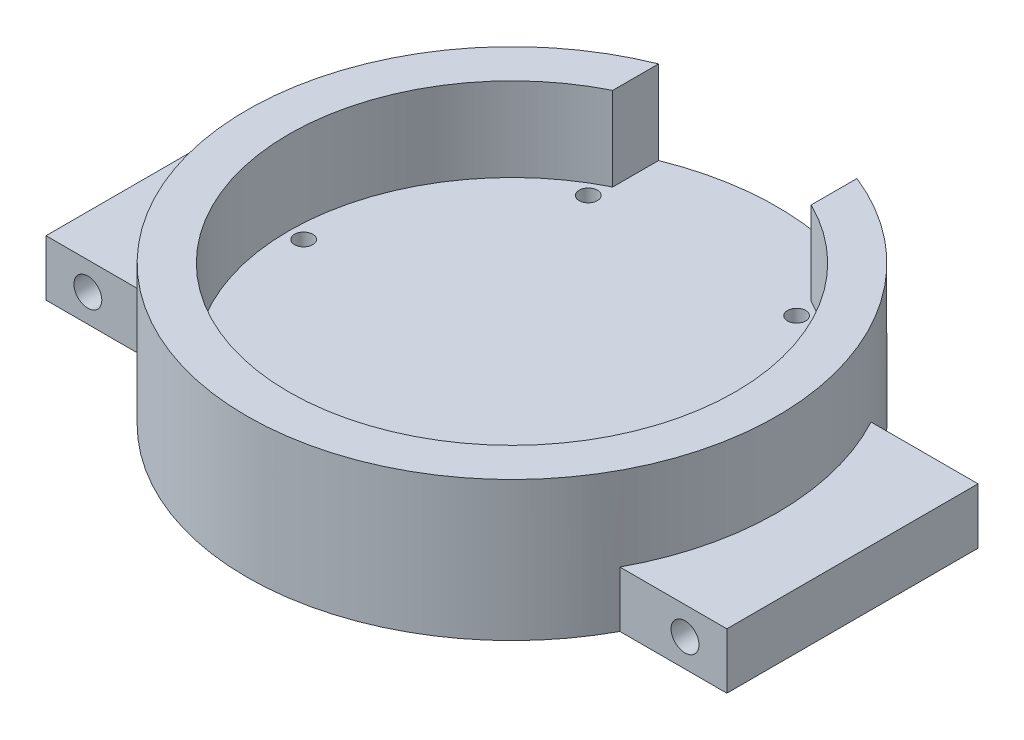
ISO-10303-21;
HEADER;
FILE_DESCRIPTION(('STEP AP214'),'2;1');
FILE_NAME('part.step','',(''),(''),'','','');
FILE_SCHEMA(('AUTOMOTIVE_DESIGN { 1 0 10303 214 1 1 1 1 }'));
ENDSEC;
DATA;
#1=APPLICATION_CONTEXT('core data for automotive mechanical design processes');
#2=APPLICATION_PROTOCOL_DEFINITION('international standard','automotive_design',2000,#1);
#3=PRODUCT_CONTEXT('',#1,'mechanical');
#4=PRODUCT('Part','Part','',(#3));
#5=PRODUCT_RELATED_PRODUCT_CATEGORY('part','',(#4));
#6=PRODUCT_DEFINITION_FORMATION('','',#4);
#7=PRODUCT_DEFINITION_CONTEXT('part definition',#1,'design');
#8=PRODUCT_DEFINITION('design','',#6,#7);
#9=PRODUCT_DEFINITION_SHAPE('','',#8);
#10=(LENGTH_UNIT() NAMED_UNIT(*) SI_UNIT(.MILLI.,.METRE.));
#11=(NAMED_UNIT(*) PLANE_ANGLE_UNIT() SI_UNIT($,.RADIAN.));
#12=(NAMED_UNIT(*) SI_UNIT($,.STERADIAN.) SOLID_ANGLE_UNIT());
#13=UNCERTAINTY_MEASURE_WITH_UNIT(LENGTH_MEASURE(1.E-05),#10,'distance_accuracy_value','');
#14=(GEOMETRIC_REPRESENTATION_CONTEXT(3) GLOBAL_UNCERTAINTY_ASSIGNED_CONTEXT((#13)) GLOBAL_UNIT_ASSIGNED_CONTEXT((#10,
#11,#12)) REPRESENTATION_CONTEXT('',''));
#15=CARTESIAN_POINT('',(0.,0.,0.));
#16=DIRECTION('',(0.,0.,1.));
#17=DIRECTION('',(1.,0.,0.));
#18=AXIS2_PLACEMENT_3D('',#15,#16,#17);
#19=CARTESIAN_POINT('',(0.,25.,-22.5));
#20=DIRECTION('',(0.,-1.,0.));
#21=DIRECTION('',(0.,0.,-1.));
#22=AXIS2_PLACEMENT_3D('',#19,#20,#21);
#23=CYLINDRICAL_SURFACE('',#22,40.);
#24=DIRECTION('',(0.,-1.,0.));
#25=VECTOR('',#24,1.);
#26=CARTESIAN_POINT('',(17.78,25.,-58.3311540422577));
#27=LINE('',#26,#25);
#28=CARTESIAN_POINT('',(17.78,25.,-58.3311540422577));
#29=VERTEX_POINT('',#28);
#30=CARTESIAN_POINT('',(17.78,10.,-58.3311540422577));
#31=VERTEX_POINT('',#30);
#32=EDGE_CURVE('E155',#29,#31,#27,.T.);
#33=ORIENTED_EDGE('',*,*,#32,.T.);
#34=CARTESIAN_POINT('',(0.,10.,-22.5));
#35=DIRECTION('',(0.,-1.,0.));
#36=DIRECTION('',(0.,0.,-1.));
#37=AXIS2_PLACEMENT_3D('',#34,#35,#36);
#38=CIRCLE('',#37,40.);
#39=CARTESIAN_POINT('',(-17.78,10.,-58.3311540422577));
#40=VERTEX_POINT('',#39);
#41=EDGE_CURVE('E12',#31,#40,#38,.T.);
#42=ORIENTED_EDGE('',*,*,#41,.T.);
#43=DIRECTION('',(0.,-1.,0.));
#44=VECTOR('',#43,1.);
#45=CARTESIAN_POINT('',(-17.78,25.,-58.3311540422577));
#46=LINE('',#45,#44);
#47=CARTESIAN_POINT('',(-17.78,25.,-58.3311540422577));
#48=VERTEX_POINT('',#47);
#49=EDGE_CURVE('E76',#48,#40,#46,.T.);
#50=ORIENTED_EDGE('',*,*,#49,.F.);
#51=CARTESIAN_POINT('',(0.,25.,-22.5));
#52=DIRECTION('',(0.,-1.,0.));
#53=DIRECTION('',(0.,0.,-1.));
#54=AXIS2_PLACEMENT_3D('',#51,#52,#53);
#55=CIRCLE('',#54,40.);
#56=EDGE_CURVE('E171',#29,#48,#55,.T.);
#57=ORIENTED_EDGE('',*,*,#56,.F.);
#58=EDGE_LOOP('',(#33,#42,#50,#57));
#59=FACE_BOUND('',#58,.T.);
#60=ADVANCED_FACE('F64',(#59),#23,.F.);
#61=CARTESIAN_POINT('',(0.,25.,-22.5));
#62=DIRECTION('',(0.,-1.,0.));
#63=DIRECTION('',(0.,0.,-1.));
#64=AXIS2_PLACEMENT_3D('',#61,#62,#63);
#65=CYLINDRICAL_SURFACE('',#64,47.5);
#66=DIRECTION('',(0.,-1.,0.));
#67=VECTOR('',#66,1.);
#68=CARTESIAN_POINT('',(41.8330013267038,25.,-45.));
#69=LINE('',#68,#67);
#70=CARTESIAN_POINT('',(41.8330013267038,0.,-45.));
#71=VERTEX_POINT('',#70);
#72=CARTESIAN_POINT('',(41.8330013267038,10.,-45.));
#73=VERTEX_POINT('',#72);
#74=EDGE_CURVE('E193',#71,#73,#69,.F.);
#75=ORIENTED_EDGE('',*,*,#74,.F.);
#76=CARTESIAN_POINT('',(0.,0.,-22.5));
#77=DIRECTION('',(0.,-1.,0.));
#78=DIRECTION('',(0.,0.,-1.));
#79=AXIS2_PLACEMENT_3D('',#76,#77,#78);
#80=CIRCLE('',#79,47.5);
#81=CARTESIAN_POINT('',(-41.8330013267038,0.,-45.));
#82=VERTEX_POINT('',#81);
#83=EDGE_CURVE('E184',#82,#71,#80,.T.);
#84=ORIENTED_EDGE('',*,*,#83,.F.);
#85=DIRECTION('',(0.,-1.,0.));
#86=VECTOR('',#85,1.);
#87=CARTESIAN_POINT('',(-41.8330013267038,25.,-45.));
#88=LINE('',#87,#86);
#89=CARTESIAN_POINT('',(-41.8330013267038,10.,-45.));
#90=VERTEX_POINT('',#89);
#91=EDGE_CURVE('E178',#90,#82,#88,.T.);
#92=ORIENTED_EDGE('',*,*,#91,.F.);
#93=CARTESIAN_POINT('',(0.,10.,-22.5));
#94=DIRECTION('',(0.,-1.,0.));
#95=DIRECTION('',(0.,0.,-1.));
#96=AXIS2_PLACEMENT_3D('',#93,#94,#95);
#97=CIRCLE('',#96,47.5);
#98=CARTESIAN_POINT('',(-41.8330013267038,10.,0.));
#99=VERTEX_POINT('',#98);
#100=EDGE_CURVE('E87',#99,#90,#97,.T.);
#101=ORIENTED_EDGE('',*,*,#100,.F.);
#102=DIRECTION('',(0.,-1.,0.));
#103=VECTOR('',#102,1.);
#104=CARTESIAN_POINT('',(-41.8330013267038,25.,0.));
#105=LINE('',#104,#103);
#106=CARTESIAN_POINT('',(-41.8330013267038,0.,0.));
#107=VERTEX_POINT('',#106);
#108=EDGE_CURVE('E188',#107,#99,#105,.F.);
#109=ORIENTED_EDGE('',*,*,#108,.F.);
#110=CARTESIAN_POINT('',(41.8330013267038,0.,0.));
#111=VERTEX_POINT('',#110);
#112=EDGE_CURVE('E181',#111,#107,#80,.T.);
#113=ORIENTED_EDGE('',*,*,#112,.F.);
#114=DIRECTION('',(0.,-1.,0.));
#115=VECTOR('',#114,1.);
#116=CARTESIAN_POINT('',(41.8330013267038,25.,0.));
#117=LINE('',#116,#115);
#118=CARTESIAN_POINT('',(41.8330013267038,10.,0.));
#119=VERTEX_POINT('',#118);
#120=EDGE_CURVE('E191',#119,#111,#117,.T.);
#121=ORIENTED_EDGE('',*,*,#120,.F.);
#122=EDGE_CURVE('E179',#73,#119,#97,.T.);
#123=ORIENTED_EDGE('',*,*,#122,.F.);
#124=EDGE_LOOP('',(#75,#84,#92,#101,#109,#113,#121,#123));
#125=FACE_BOUND('',#124,.T.);
#126=CARTESIAN_POINT('',(0.,10.,-22.5));
#127=DIRECTION('',(0.,1.,0.));
#128=DIRECTION('',(0.,0.,1.));
#129=AXIS2_PLACEMENT_3D('',#126,#127,#128);
#130=CIRCLE('',#129,47.5);
#131=CARTESIAN_POINT('',(17.78,10.,-66.5468114623522));
#132=VERTEX_POINT('',#131);
#133=CARTESIAN_POINT('',(-17.78,10.,-66.5468114623522));
#134=VERTEX_POINT('',#133);
#135=EDGE_CURVE('E296',#132,#134,#130,.T.);
#136=ORIENTED_EDGE('',*,*,#135,.F.);
#137=DIRECTION('',(0.,-1.,0.));
#138=VECTOR('',#137,1.);
#139=CARTESIAN_POINT('',(17.78,25.,-66.5468114623522));
#140=LINE('',#139,#138);
#141=CARTESIAN_POINT('',(17.78,25.,-66.5468114623522));
#142=VERTEX_POINT('',#141);
#143=EDGE_CURVE('E165',#142,#132,#140,.T.);
#144=ORIENTED_EDGE('',*,*,#143,.F.);
#145=CARTESIAN_POINT('',(0.,25.,-22.5));
#146=DIRECTION('',(0.,-1.,0.));
#147=DIRECTION('',(0.,0.,-1.));
#148=AXIS2_PLACEMENT_3D('',#145,#146,#147);
#149=CIRCLE('',#148,47.5);
#150=CARTESIAN_POINT('',(-17.78,25.,-66.5468114623522));
#151=VERTEX_POINT('',#150);
#152=EDGE_CURVE('E173',#142,#151,#149,.T.);
#153=ORIENTED_EDGE('',*,*,#152,.T.);
#154=DIRECTION('',(0.,-1.,0.));
#155=VECTOR('',#154,1.);
#156=CARTESIAN_POINT('',(-17.78,25.,-66.5468114623522));
#157=LINE('',#156,#155);
#158=EDGE_CURVE('E305',#151,#134,#157,.T.);
#159=ORIENTED_EDGE('',*,*,#158,.T.);
#160=EDGE_LOOP('',(#136,#144,#153,#159));
#161=FACE_BOUND('',#160,.T.);
#162=ADVANCED_FACE('F331',(#125,#161),#65,.T.);
#163=CARTESIAN_POINT('',(0.,25.,0.));
#164=DIRECTION('',(0.,-1.,0.));
#165=DIRECTION('',(0.,0.,-1.));
#166=AXIS2_PLACEMENT_3D('',#163,#164,#165);
#167=PLANE('',#166);
#168=DIRECTION('',(0.,0.,-1.));
#169=VECTOR('',#168,1.);
#170=CARTESIAN_POINT('',(17.78,25.,-58.3311540422577));
#171=LINE('',#170,#169);
#172=EDGE_CURVE('E157',#29,#142,#171,.T.);
#173=ORIENTED_EDGE('',*,*,#172,.F.);
#174=ORIENTED_EDGE('',*,*,#56,.T.);
#175=DIRECTION('',(0.,0.,1.));
#176=VECTOR('',#175,1.);
#177=CARTESIAN_POINT('',(-17.78,25.,-58.3311540422577));
#178=LINE('',#177,#176);
#179=EDGE_CURVE('E172',#151,#48,#178,.T.);
#180=ORIENTED_EDGE('',*,*,#179,.F.);
#181=ORIENTED_EDGE('',*,*,#152,.F.);
#182=EDGE_LOOP('',(#173,#174,#180,#181));
#183=FACE_BOUND('',#182,.T.);
#184=ADVANCED_FACE('F169',(#183),#167,.F.);
#185=CARTESIAN_POINT('',(0.,10.,0.));
#186=DIRECTION('',(0.,-1.,0.));
#187=DIRECTION('',(0.,0.,-1.));
#188=AXIS2_PLACEMENT_3D('',#185,#186,#187);
#189=PLANE('',#188);
#190=DIRECTION('',(-1.,0.,0.));
#191=VECTOR('',#190,1.);
#192=CARTESIAN_POINT('',(-61.,10.,-45.));
#193=LINE('',#192,#191);
#194=CARTESIAN_POINT('',(61.,10.,-45.));
#195=VERTEX_POINT('',#194);
#196=EDGE_CURVE('E210',#195,#73,#193,.T.);
#197=ORIENTED_EDGE('',*,*,#196,.T.);
#198=ORIENTED_EDGE('',*,*,#122,.T.);
#199=DIRECTION('',(1.,0.,0.));
#200=VECTOR('',#199,1.);
#201=CARTESIAN_POINT('',(-61.,10.,0.));
#202=LINE('',#201,#200);
#203=CARTESIAN_POINT('',(61.,10.,0.));
#204=VERTEX_POINT('',#203);
#205=EDGE_CURVE('E198',#119,#204,#202,.T.);
#206=ORIENTED_EDGE('',*,*,#205,.T.);
#207=DIRECTION('',(0.,0.,-1.));
#208=VECTOR('',#207,1.);
#209=CARTESIAN_POINT('',(61.,10.,0.));
#210=LINE('',#209,#208);
#211=EDGE_CURVE('E203',#204,#195,#210,.T.);
#212=ORIENTED_EDGE('',*,*,#211,.T.);
#213=EDGE_LOOP('',(#197,#198,#206,#212));
#214=FACE_BOUND('',#213,.T.);
#215=ADVANCED_FACE('F343',(#214),#189,.F.);
#216=CARTESIAN_POINT('',(-61.,10.,0.));
#217=DIRECTION('',(0.,0.,-1.));
#218=DIRECTION('',(-1.,0.,0.));
#219=AXIS2_PLACEMENT_3D('',#216,#217,#218);
#220=PLANE('',#219);
#221=CARTESIAN_POINT('',(-53.5,5.,0.));
#222=DIRECTION('',(0.,0.,1.));
#223=DIRECTION('',(1.,0.,0.));
#224=AXIS2_PLACEMENT_3D('',#221,#222,#223);
#225=CIRCLE('',#224,2.5);
#226=CARTESIAN_POINT('',(-51.,5.,0.));
#227=VERTEX_POINT('',#226);
#228=EDGE_CURVE('E231',#227,#227,#225,.T.);
#229=ORIENTED_EDGE('',*,*,#228,.F.);
#230=EDGE_LOOP('',(#229));
#231=FACE_BOUND('',#230,.T.);
#232=DIRECTION('',(1.,0.,0.));
#233=VECTOR('',#232,1.);
#234=CARTESIAN_POINT('',(-61.,0.,0.));
#235=LINE('',#234,#233);
#236=CARTESIAN_POINT('',(-61.,0.,0.));
#237=VERTEX_POINT('',#236);
#238=EDGE_CURVE('E213',#237,#107,#235,.T.);
#239=ORIENTED_EDGE('',*,*,#238,.T.);
#240=ORIENTED_EDGE('',*,*,#108,.T.);
#241=CARTESIAN_POINT('',(-61.,10.,0.));
#242=VERTEX_POINT('',#241);
#243=EDGE_CURVE('E202',#242,#99,#202,.T.);
#244=ORIENTED_EDGE('',*,*,#243,.F.);
#245=DIRECTION('',(0.,-1.,0.));
#246=VECTOR('',#245,1.);
#247=CARTESIAN_POINT('',(-61.,10.,0.));
#248=LINE('',#247,#246);
#249=EDGE_CURVE('E68',#242,#237,#248,.T.);
#250=ORIENTED_EDGE('',*,*,#249,.T.);
#251=EDGE_LOOP('',(#239,#240,#244,#250));
#252=FACE_BOUND('',#251,.T.);
#253=ADVANCED_FACE('F357',(#231,#252),#220,.F.);
#254=CARTESIAN_POINT('',(-61.,10.,-45.));
#255=DIRECTION('',(0.,0.,1.));
#256=DIRECTION('',(1.,0.,0.));
#257=AXIS2_PLACEMENT_3D('',#254,#255,#256);
#258=PLANE('',#257);
#259=CARTESIAN_POINT('',(53.5,5.,-45.));
#260=DIRECTION('',(0.,0.,1.));
#261=DIRECTION('',(1.,0.,0.));
#262=AXIS2_PLACEMENT_3D('',#259,#260,#261);
#263=CIRCLE('',#262,2.5);
#264=CARTESIAN_POINT('',(56.,5.,-45.));
#265=VERTEX_POINT('',#264);
#266=EDGE_CURVE('E190',#265,#265,#263,.T.);
#267=ORIENTED_EDGE('',*,*,#266,.T.);
#268=EDGE_LOOP('',(#267));
#269=FACE_BOUND('',#268,.T.);
#270=DIRECTION('',(-1.,0.,0.));
#271=VECTOR('',#270,1.);
#272=CARTESIAN_POINT('',(-61.,0.,-45.));
#273=LINE('',#272,#271);
#274=CARTESIAN_POINT('',(61.,0.,-45.));
#275=VERTEX_POINT('',#274);
#276=EDGE_CURVE('E201',#275,#71,#273,.T.);
#277=ORIENTED_EDGE('',*,*,#276,.T.);
#278=ORIENTED_EDGE('',*,*,#74,.T.);
#279=ORIENTED_EDGE('',*,*,#196,.F.);
#280=DIRECTION('',(0.,-1.,0.));
#281=VECTOR('',#280,1.);
#282=CARTESIAN_POINT('',(61.,10.,-45.));
#283=LINE('',#282,#281);
#284=EDGE_CURVE('E222',#195,#275,#283,.T.);
#285=ORIENTED_EDGE('',*,*,#284,.T.);
#286=EDGE_LOOP('',(#277,#278,#279,#285));
#287=FACE_BOUND('',#286,.T.);
#288=ADVANCED_FACE('F315',(#269,#287),#258,.F.);
#289=CARTESIAN_POINT('',(-61.,10.,0.));
#290=DIRECTION('',(1.,0.,0.));
#291=DIRECTION('',(0.,0.,-1.));
#292=AXIS2_PLACEMENT_3D('',#289,#290,#291);
#293=PLANE('',#292);
#294=DIRECTION('',(0.,0.,1.));
#295=VECTOR('',#294,1.);
#296=CARTESIAN_POINT('',(-61.,0.,0.));
#297=LINE('',#296,#295);
#298=CARTESIAN_POINT('',(-61.,0.,-45.));
#299=VERTEX_POINT('',#298);
#300=EDGE_CURVE('E192',#299,#237,#297,.T.);
#301=ORIENTED_EDGE('',*,*,#300,.T.);
#302=ORIENTED_EDGE('',*,*,#249,.F.);
#303=DIRECTION('',(0.,0.,1.));
#304=VECTOR('',#303,1.);
#305=CARTESIAN_POINT('',(-61.,10.,0.));
#306=LINE('',#305,#304);
#307=CARTESIAN_POINT('',(-61.,10.,-45.));
#308=VERTEX_POINT('',#307);
#309=EDGE_CURVE('E199',#308,#242,#306,.T.);
#310=ORIENTED_EDGE('',*,*,#309,.F.);
#311=DIRECTION('',(0.,-1.,0.));
#312=VECTOR('',#311,1.);
#313=CARTESIAN_POINT('',(-61.,10.,-45.));
#314=LINE('',#313,#312);
#315=EDGE_CURVE('E208',#308,#299,#314,.T.);
#316=ORIENTED_EDGE('',*,*,#315,.T.);
#317=EDGE_LOOP('',(#301,#302,#310,#316));
#318=FACE_BOUND('',#317,.T.);
#319=ADVANCED_FACE('F65',(#318),#293,.F.);
#320=CARTESIAN_POINT('',(53.5,5.,0.));
#321=DIRECTION('',(0.,0.,1.));
#322=DIRECTION('',(1.,0.,0.));
#323=AXIS2_PLACEMENT_3D('',#320,#321,#322);
#324=CIRCLE('',#323,2.5);
#325=CARTESIAN_POINT('',(56.,5.,0.));
#326=VERTEX_POINT('',#325);
#327=EDGE_CURVE('E161',#326,#326,#324,.T.);
#328=ORIENTED_EDGE('',*,*,#327,.F.);
#329=EDGE_LOOP('',(#328));
#330=FACE_BOUND('',#329,.T.);
#331=ORIENTED_EDGE('',*,*,#205,.F.);
#332=ORIENTED_EDGE('',*,*,#120,.T.);
#333=CARTESIAN_POINT('',(61.,0.,0.));
#334=VERTEX_POINT('',#333);
#335=EDGE_CURVE('E215',#111,#334,#235,.T.);
#336=ORIENTED_EDGE('',*,*,#335,.T.);
#337=DIRECTION('',(0.,-1.,0.));
#338=VECTOR('',#337,1.);
#339=CARTESIAN_POINT('',(61.,10.,0.));
#340=LINE('',#339,#338);
#341=EDGE_CURVE('E225',#204,#334,#340,.T.);
#342=ORIENTED_EDGE('',*,*,#341,.F.);
#343=EDGE_LOOP('',(#331,#332,#336,#342));
#344=FACE_BOUND('',#343,.T.);
#345=ADVANCED_FACE('F354',(#330,#344),#220,.F.);
#346=CARTESIAN_POINT('',(61.,10.,0.));
#347=DIRECTION('',(-1.,0.,0.));
#348=DIRECTION('',(0.,0.,1.));
#349=AXIS2_PLACEMENT_3D('',#346,#347,#348);
#350=PLANE('',#349);
#351=DIRECTION('',(0.,0.,-1.));
#352=VECTOR('',#351,1.);
#353=CARTESIAN_POINT('',(61.,0.,0.));
#354=LINE('',#353,#352);
#355=EDGE_CURVE('E217',#334,#275,#354,.T.);
#356=ORIENTED_EDGE('',*,*,#355,.T.);
#357=ORIENTED_EDGE('',*,*,#284,.F.);
#358=ORIENTED_EDGE('',*,*,#211,.F.);
#359=ORIENTED_EDGE('',*,*,#341,.T.);
#360=EDGE_LOOP('',(#356,#357,#358,#359));
#361=FACE_BOUND('',#360,.T.);
#362=ADVANCED_FACE('F348',(#361),#350,.F.);
#363=CARTESIAN_POINT('',(-53.5,5.,-45.));
#364=DIRECTION('',(0.,0.,1.));
#365=DIRECTION('',(1.,0.,0.));
#366=AXIS2_PLACEMENT_3D('',#363,#364,#365);
#367=CIRCLE('',#366,2.5);
#368=CARTESIAN_POINT('',(-51.,5.,-45.));
#369=VERTEX_POINT('',#368);
#370=EDGE_CURVE('E229',#369,#369,#367,.T.);
#371=ORIENTED_EDGE('',*,*,#370,.T.);
#372=EDGE_LOOP('',(#371));
#373=FACE_BOUND('',#372,.T.);
#374=EDGE_CURVE('E207',#90,#308,#193,.T.);
#375=ORIENTED_EDGE('',*,*,#374,.F.);
#376=ORIENTED_EDGE('',*,*,#91,.T.);
#377=EDGE_CURVE('E220',#82,#299,#273,.T.);
#378=ORIENTED_EDGE('',*,*,#377,.T.);
#379=ORIENTED_EDGE('',*,*,#315,.F.);
#380=EDGE_LOOP('',(#375,#376,#378,#379));
#381=FACE_BOUND('',#380,.T.);
#382=ADVANCED_FACE('F345',(#373,#381),#258,.F.);
#383=ORIENTED_EDGE('',*,*,#243,.T.);
#384=ORIENTED_EDGE('',*,*,#100,.T.);
#385=ORIENTED_EDGE('',*,*,#374,.T.);
#386=ORIENTED_EDGE('',*,*,#309,.T.);
#387=EDGE_LOOP('',(#383,#384,#385,#386));
#388=FACE_BOUND('',#387,.T.);
#389=ADVANCED_FACE('F339',(#388),#189,.F.);
#390=CARTESIAN_POINT('',(0.,0.,0.));
#391=DIRECTION('',(0.,-1.,0.));
#392=DIRECTION('',(0.,0.,-1.));
#393=AXIS2_PLACEMENT_3D('',#390,#391,#392);
#394=PLANE('',#393);
#395=CARTESIAN_POINT('',(-18.6665000000004,0.,9.83132639948424));
#396=DIRECTION('',(0.,-1.,0.));
#397=DIRECTION('',(0.,0.,-1.));
#398=AXIS2_PLACEMENT_3D('',#395,#396,#397);
#399=CIRCLE('',#398,3.37311999999999);
#400=CARTESIAN_POINT('',(-18.6665000000004,0.,6.45820639948424));
#401=VERTEX_POINT('',#400);
#402=EDGE_CURVE('E482',#401,#401,#399,.T.);
#403=ORIENTED_EDGE('',*,*,#402,.F.);
#404=EDGE_LOOP('',(#403));
#405=FACE_BOUND('',#404,.T.);
#406=CARTESIAN_POINT('',(18.6664999999997,0.,9.83132639948461));
#407=DIRECTION('',(0.,-1.,0.));
#408=DIRECTION('',(0.,0.,-1.));
#409=AXIS2_PLACEMENT_3D('',#406,#407,#408);
#410=CIRCLE('',#409,3.37311999999999);
#411=CARTESIAN_POINT('',(18.6664999999997,0.,6.45820639948462));
#412=VERTEX_POINT('',#411);
#413=EDGE_CURVE('E267',#412,#412,#410,.T.);
#414=ORIENTED_EDGE('',*,*,#413,.F.);
#415=EDGE_LOOP('',(#414));
#416=FACE_BOUND('',#415,.T.);
#417=CARTESIAN_POINT('',(37.333,0.,-22.4999999999997));
#418=DIRECTION('',(0.,-1.,0.));
#419=DIRECTION('',(0.,0.,-1.));
#420=AXIS2_PLACEMENT_3D('',#417,#418,#419);
#421=CIRCLE('',#420,3.37311999999999);
#422=CARTESIAN_POINT('',(37.333,0.,-25.8731199999997));
#423=VERTEX_POINT('',#422);
#424=EDGE_CURVE('E251',#423,#423,#421,.T.);
#425=ORIENTED_EDGE('',*,*,#424,.F.);
#426=EDGE_LOOP('',(#425));
#427=FACE_BOUND('',#426,.T.);
#428=CARTESIAN_POINT('',(18.6665000000002,0.,-54.8313263994844));
#429=DIRECTION('',(0.,-1.,0.));
#430=DIRECTION('',(0.,0.,-1.));
#431=AXIS2_PLACEMENT_3D('',#428,#429,#430);
#432=CIRCLE('',#431,3.37311999999999);
#433=CARTESIAN_POINT('',(18.6665000000002,0.,-58.2044463994844));
#434=VERTEX_POINT('',#433);
#435=EDGE_CURVE('E249',#434,#434,#432,.T.);
#436=ORIENTED_EDGE('',*,*,#435,.F.);
#437=EDGE_LOOP('',(#436));
#438=FACE_BOUND('',#437,.T.);
#439=CARTESIAN_POINT('',(-18.6664999999999,0.,-54.8313263994845));
#440=DIRECTION('',(0.,-1.,0.));
#441=DIRECTION('',(0.,0.,-1.));
#442=AXIS2_PLACEMENT_3D('',#439,#440,#441);
#443=CIRCLE('',#442,3.37311999999999);
#444=CARTESIAN_POINT('',(-18.6664999999999,0.,-58.2044463994845));
#445=VERTEX_POINT('',#444);
#446=EDGE_CURVE('E246',#445,#445,#443,.T.);
#447=ORIENTED_EDGE('',*,*,#446,.F.);
#448=EDGE_LOOP('',(#447));
#449=FACE_BOUND('',#448,.T.);
#450=CARTESIAN_POINT('',(-37.333,0.,-22.5));
#451=DIRECTION('',(0.,-1.,0.));
#452=DIRECTION('',(0.,0.,-1.));
#453=AXIS2_PLACEMENT_3D('',#450,#451,#452);
#454=CIRCLE('',#453,3.37311999999999);
#455=CARTESIAN_POINT('',(-37.333,0.,-25.87312));
#456=VERTEX_POINT('',#455);
#457=EDGE_CURVE('E241',#456,#456,#454,.T.);
#458=ORIENTED_EDGE('',*,*,#457,.F.);
#459=EDGE_LOOP('',(#458));
#460=FACE_BOUND('',#459,.T.);
#461=ORIENTED_EDGE('',*,*,#112,.T.);
#462=ORIENTED_EDGE('',*,*,#238,.F.);
#463=ORIENTED_EDGE('',*,*,#300,.F.);
#464=ORIENTED_EDGE('',*,*,#377,.F.);
#465=ORIENTED_EDGE('',*,*,#83,.T.);
#466=ORIENTED_EDGE('',*,*,#276,.F.);
#467=ORIENTED_EDGE('',*,*,#355,.F.);
#468=ORIENTED_EDGE('',*,*,#335,.F.);
#469=EDGE_LOOP('',(#461,#462,#463,#464,#465,#466,#467,#468));
#470=FACE_BOUND('',#469,.T.);
#471=ADVANCED_FACE('F341',(#405,#416,#427,#438,#449,#460,#470),#394,.T.);
#472=CARTESIAN_POINT('',(-18.6665000000004,10.,9.83132639948424));
#473=DIRECTION('',(0.,-1.,0.));
#474=DIRECTION('',(0.,0.,-1.));
#475=AXIS2_PLACEMENT_3D('',#472,#473,#474);
#476=CIRCLE('',#475,1.63195);
#477=CARTESIAN_POINT('',(-18.6665000000004,10.,8.19937639948424));
#478=VERTEX_POINT('',#477);
#479=EDGE_CURVE('E62',#478,#478,#476,.T.);
#480=ORIENTED_EDGE('',*,*,#479,.T.);
#481=EDGE_LOOP('',(#480));
#482=FACE_BOUND('',#481,.T.);
#483=CARTESIAN_POINT('',(18.6664999999997,10.,9.83132639948461));
#484=DIRECTION('',(0.,-1.,0.));
#485=DIRECTION('',(0.,0.,-1.));
#486=AXIS2_PLACEMENT_3D('',#483,#484,#485);
#487=CIRCLE('',#486,1.63195);
#488=CARTESIAN_POINT('',(18.6664999999997,10.,8.19937639948462));
#489=VERTEX_POINT('',#488);
#490=EDGE_CURVE('E255',#489,#489,#487,.T.);
#491=ORIENTED_EDGE('',*,*,#490,.T.);
#492=EDGE_LOOP('',(#491));
#493=FACE_BOUND('',#492,.T.);
#494=CARTESIAN_POINT('',(37.333,10.,-22.4999999999997));
#495=DIRECTION('',(0.,-1.,0.));
#496=DIRECTION('',(0.,0.,-1.));
#497=AXIS2_PLACEMENT_3D('',#494,#495,#496);
#498=CIRCLE('',#497,1.63195);
#499=CARTESIAN_POINT('',(37.333,10.,-24.1319499999997));
#500=VERTEX_POINT('',#499);
#501=EDGE_CURVE('E247',#500,#500,#498,.T.);
#502=ORIENTED_EDGE('',*,*,#501,.T.);
#503=EDGE_LOOP('',(#502));
#504=FACE_BOUND('',#503,.T.);
#505=CARTESIAN_POINT('',(18.6665000000002,10.,-54.8313263994844));
#506=DIRECTION('',(0.,-1.,0.));
#507=DIRECTION('',(0.,0.,-1.));
#508=AXIS2_PLACEMENT_3D('',#505,#506,#507);
#509=CIRCLE('',#508,1.63195);
#510=CARTESIAN_POINT('',(18.6665000000002,10.,-56.4632763994844));
#511=VERTEX_POINT('',#510);
#512=EDGE_CURVE('E243',#511,#511,#509,.T.);
#513=ORIENTED_EDGE('',*,*,#512,.T.);
#514=EDGE_LOOP('',(#513));
#515=FACE_BOUND('',#514,.T.);
#516=CARTESIAN_POINT('',(-18.6664999999999,10.,-54.8313263994845));
#517=DIRECTION('',(0.,-1.,0.));
#518=DIRECTION('',(0.,0.,-1.));
#519=AXIS2_PLACEMENT_3D('',#516,#517,#518);
#520=CIRCLE('',#519,1.63195);
#521=CARTESIAN_POINT('',(-18.6664999999999,10.,-56.4632763994845));
#522=VERTEX_POINT('',#521);
#523=EDGE_CURVE('E238',#522,#522,#520,.T.);
#524=ORIENTED_EDGE('',*,*,#523,.T.);
#525=EDGE_LOOP('',(#524));
#526=FACE_BOUND('',#525,.T.);
#527=CARTESIAN_POINT('',(-37.333,10.,-22.5));
#528=DIRECTION('',(0.,-1.,0.));
#529=DIRECTION('',(0.,0.,-1.));
#530=AXIS2_PLACEMENT_3D('',#527,#528,#529);
#531=CIRCLE('',#530,1.63195);
#532=CARTESIAN_POINT('',(-37.333,10.,-24.13195));
#533=VERTEX_POINT('',#532);
#534=EDGE_CURVE('E234',#533,#533,#531,.T.);
#535=ORIENTED_EDGE('',*,*,#534,.T.);
#536=EDGE_LOOP('',(#535));
#537=FACE_BOUND('',#536,.T.);
#538=ORIENTED_EDGE('',*,*,#41,.F.);
#539=DIRECTION('',(0.,0.,-1.));
#540=VECTOR('',#539,1.);
#541=CARTESIAN_POINT('',(17.78,10.,-58.3311540422577));
#542=LINE('',#541,#540);
#543=EDGE_CURVE('E158',#31,#132,#542,.T.);
#544=ORIENTED_EDGE('',*,*,#543,.T.);
#545=ORIENTED_EDGE('',*,*,#135,.T.);
#546=DIRECTION('',(0.,0.,1.));
#547=VECTOR('',#546,1.);
#548=CARTESIAN_POINT('',(-17.78,10.,-58.3311540422577));
#549=LINE('',#548,#547);
#550=EDGE_CURVE('E174',#134,#40,#549,.T.);
#551=ORIENTED_EDGE('',*,*,#550,.T.);
#552=EDGE_LOOP('',(#538,#544,#545,#551));
#553=FACE_BOUND('',#552,.T.);
#554=ADVANCED_FACE('F329',(#482,#493,#504,#515,#526,#537,#553),#189,.F.);
#555=CARTESIAN_POINT('',(-53.5,5.,-70.));
#556=DIRECTION('',(0.,0.,1.));
#557=DIRECTION('',(1.,0.,0.));
#558=AXIS2_PLACEMENT_3D('',#555,#556,#557);
#559=CYLINDRICAL_SURFACE('',#558,2.5);
#560=ORIENTED_EDGE('',*,*,#228,.T.);
#561=EDGE_LOOP('',(#560));
#562=FACE_BOUND('',#561,.T.);
#563=ORIENTED_EDGE('',*,*,#370,.F.);
#564=EDGE_LOOP('',(#563));
#565=FACE_BOUND('',#564,.T.);
#566=ADVANCED_FACE('F320',(#562,#565),#559,.F.);
#567=CARTESIAN_POINT('',(53.5,5.,-70.));
#568=DIRECTION('',(0.,0.,1.));
#569=DIRECTION('',(1.,0.,0.));
#570=AXIS2_PLACEMENT_3D('',#567,#568,#569);
#571=CYLINDRICAL_SURFACE('',#570,2.5);
#572=ORIENTED_EDGE('',*,*,#327,.T.);
#573=EDGE_LOOP('',(#572));
#574=FACE_BOUND('',#573,.T.);
#575=ORIENTED_EDGE('',*,*,#266,.F.);
#576=EDGE_LOOP('',(#575));
#577=FACE_BOUND('',#576,.T.);
#578=ADVANCED_FACE('F314',(#574,#577),#571,.F.);
#579=CARTESIAN_POINT('',(17.78,25.,-58.3311540422577));
#580=DIRECTION('',(-1.,0.,0.));
#581=DIRECTION('',(0.,0.,1.));
#582=AXIS2_PLACEMENT_3D('',#579,#580,#581);
#583=PLANE('',#582);
#584=ORIENTED_EDGE('',*,*,#543,.F.);
#585=ORIENTED_EDGE('',*,*,#32,.F.);
#586=ORIENTED_EDGE('',*,*,#172,.T.);
#587=ORIENTED_EDGE('',*,*,#143,.T.);
#588=EDGE_LOOP('',(#584,#585,#586,#587));
#589=FACE_BOUND('',#588,.T.);
#590=ADVANCED_FACE('F153',(#589),#583,.T.);
#591=CARTESIAN_POINT('',(-17.78,25.,-58.3311540422577));
#592=DIRECTION('',(1.,0.,0.));
#593=DIRECTION('',(0.,0.,-1.));
#594=AXIS2_PLACEMENT_3D('',#591,#592,#593);
#595=PLANE('',#594);
#596=ORIENTED_EDGE('',*,*,#550,.F.);
#597=ORIENTED_EDGE('',*,*,#158,.F.);
#598=ORIENTED_EDGE('',*,*,#179,.T.);
#599=ORIENTED_EDGE('',*,*,#49,.T.);
#600=EDGE_LOOP('',(#596,#597,#598,#599));
#601=FACE_BOUND('',#600,.T.);
#602=ADVANCED_FACE('F322',(#601),#595,.T.);
#603=CARTESIAN_POINT('',(-37.333,0.,-22.5));
#604=DIRECTION('',(0.,-1.,0.));
#605=DIRECTION('',(0.,0.,-1.));
#606=AXIS2_PLACEMENT_3D('',#603,#604,#605);
#607=CYLINDRICAL_SURFACE('',#606,1.63195);
#608=CARTESIAN_POINT('',(-37.333,1.7272,-22.5));
#609=DIRECTION('',(0.,-1.,0.));
#610=DIRECTION('',(0.,0.,-1.));
#611=AXIS2_PLACEMENT_3D('',#608,#609,#610);
#612=CIRCLE('',#611,1.63195);
#613=CARTESIAN_POINT('',(-37.333,1.7272,-24.13195));
#614=VERTEX_POINT('',#613);
#615=EDGE_CURVE('E240',#614,#614,#612,.T.);
#616=ORIENTED_EDGE('',*,*,#615,.T.);
#617=EDGE_LOOP('',(#616));
#618=FACE_BOUND('',#617,.T.);
#619=ORIENTED_EDGE('',*,*,#534,.F.);
#620=EDGE_LOOP('',(#619));
#621=FACE_BOUND('',#620,.T.);
#622=ADVANCED_FACE('F400',(#618,#621),#607,.F.);
#623=CARTESIAN_POINT('',(-35.70105,1.7272,-22.5));
#624=DIRECTION('',(0.,1.,0.));
#625=DIRECTION('',(0.,0.,1.));
#626=AXIS2_PLACEMENT_3D('',#623,#624,#625);
#627=PLANE('',#626);
#628=ORIENTED_EDGE('',*,*,#615,.F.);
#629=EDGE_LOOP('',(#628));
#630=FACE_BOUND('',#629,.T.);
#631=CARTESIAN_POINT('',(-37.333,1.7272,-22.5));
#632=DIRECTION('',(0.,-1.,0.));
#633=DIRECTION('',(0.,0.,-1.));
#634=AXIS2_PLACEMENT_3D('',#631,#632,#633);
#635=CIRCLE('',#634,3.37311999999999);
#636=CARTESIAN_POINT('',(-37.333,1.7272,-25.87312));
#637=VERTEX_POINT('',#636);
#638=EDGE_CURVE('E293',#637,#637,#635,.T.);
#639=ORIENTED_EDGE('',*,*,#638,.T.);
#640=EDGE_LOOP('',(#639));
#641=FACE_BOUND('',#640,.T.);
#642=ADVANCED_FACE('F403',(#630,#641),#627,.F.);
#643=CARTESIAN_POINT('',(-37.333,0.,-22.5));
#644=DIRECTION('',(0.,-1.,0.));
#645=DIRECTION('',(0.,0.,-1.));
#646=AXIS2_PLACEMENT_3D('',#643,#644,#645);
#647=CYLINDRICAL_SURFACE('',#646,3.37311999999999);
#648=ORIENTED_EDGE('',*,*,#638,.F.);
#649=EDGE_LOOP('',(#648));
#650=FACE_BOUND('',#649,.T.);
#651=ORIENTED_EDGE('',*,*,#457,.T.);
#652=EDGE_LOOP('',(#651));
#653=FACE_BOUND('',#652,.T.);
#654=ADVANCED_FACE('F412',(#650,#653),#647,.F.);
#655=CARTESIAN_POINT('',(-18.6664999999999,0.,-54.8313263994845));
#656=DIRECTION('',(0.,-1.,0.));
#657=DIRECTION('',(0.,0.,-1.));
#658=AXIS2_PLACEMENT_3D('',#655,#656,#657);
#659=CYLINDRICAL_SURFACE('',#658,1.63195);
#660=CARTESIAN_POINT('',(-18.6664999999999,1.7272,-54.8313263994845));
#661=DIRECTION('',(0.,-1.,0.));
#662=DIRECTION('',(0.,0.,-1.));
#663=AXIS2_PLACEMENT_3D('',#660,#661,#662);
#664=CIRCLE('',#663,1.63195);
#665=CARTESIAN_POINT('',(-18.6664999999999,1.7272,-56.4632763994845));
#666=VERTEX_POINT('',#665);
#667=EDGE_CURVE('E245',#666,#666,#664,.T.);
#668=ORIENTED_EDGE('',*,*,#667,.T.);
#669=EDGE_LOOP('',(#668));
#670=FACE_BOUND('',#669,.T.);
#671=ORIENTED_EDGE('',*,*,#523,.F.);
#672=EDGE_LOOP('',(#671));
#673=FACE_BOUND('',#672,.T.);
#674=ADVANCED_FACE('F413',(#670,#673),#659,.F.);
#675=CARTESIAN_POINT('',(-17.0345499999999,1.7272,-54.8313263994845));
#676=DIRECTION('',(0.,1.,0.));
#677=DIRECTION('',(0.,0.,1.));
#678=AXIS2_PLACEMENT_3D('',#675,#676,#677);
#679=PLANE('',#678);
#680=ORIENTED_EDGE('',*,*,#667,.F.);
#681=EDGE_LOOP('',(#680));
#682=FACE_BOUND('',#681,.T.);
#683=CARTESIAN_POINT('',(-18.6664999999999,1.7272,-54.8313263994845));
#684=DIRECTION('',(0.,-1.,0.));
#685=DIRECTION('',(0.,0.,-1.));
#686=AXIS2_PLACEMENT_3D('',#683,#684,#685);
#687=CIRCLE('',#686,3.37312);
#688=CARTESIAN_POINT('',(-18.6664999999999,1.7272,-58.2044463994845));
#689=VERTEX_POINT('',#688);
#690=EDGE_CURVE('E281',#689,#689,#687,.T.);
#691=ORIENTED_EDGE('',*,*,#690,.T.);
#692=EDGE_LOOP('',(#691));
#693=FACE_BOUND('',#692,.T.);
#694=ADVANCED_FACE('F418',(#682,#693),#679,.F.);
#695=CARTESIAN_POINT('',(-18.6664999999999,0.,-54.8313263994845));
#696=DIRECTION('',(0.,-1.,0.));
#697=DIRECTION('',(0.,0.,-1.));
#698=AXIS2_PLACEMENT_3D('',#695,#696,#697);
#699=CYLINDRICAL_SURFACE('',#698,3.37312);
#700=ORIENTED_EDGE('',*,*,#690,.F.);
#701=EDGE_LOOP('',(#700));
#702=FACE_BOUND('',#701,.T.);
#703=ORIENTED_EDGE('',*,*,#446,.T.);
#704=EDGE_LOOP('',(#703));
#705=FACE_BOUND('',#704,.T.);
#706=ADVANCED_FACE('F421',(#702,#705),#699,.F.);
#707=CARTESIAN_POINT('',(18.6665000000002,0.,-54.8313263994844));
#708=DIRECTION('',(0.,-1.,0.));
#709=DIRECTION('',(0.,0.,-1.));
#710=AXIS2_PLACEMENT_3D('',#707,#708,#709);
#711=CYLINDRICAL_SURFACE('',#710,1.63195);
#712=CARTESIAN_POINT('',(18.6665000000002,1.7272,-54.8313263994844));
#713=DIRECTION('',(0.,-1.,0.));
#714=DIRECTION('',(0.,0.,-1.));
#715=AXIS2_PLACEMENT_3D('',#712,#713,#714);
#716=CIRCLE('',#715,1.63195);
#717=CARTESIAN_POINT('',(18.6665000000002,1.7272,-56.4632763994844));
#718=VERTEX_POINT('',#717);
#719=EDGE_CURVE('E250',#718,#718,#716,.T.);
#720=ORIENTED_EDGE('',*,*,#719,.T.);
#721=EDGE_LOOP('',(#720));
#722=FACE_BOUND('',#721,.T.);
#723=ORIENTED_EDGE('',*,*,#512,.F.);
#724=EDGE_LOOP('',(#723));
#725=FACE_BOUND('',#724,.T.);
#726=ADVANCED_FACE('F430',(#722,#725),#711,.F.);
#727=CARTESIAN_POINT('',(20.2984500000002,1.7272,-54.8313263994844));
#728=DIRECTION('',(0.,1.,0.));
#729=DIRECTION('',(0.,0.,1.));
#730=AXIS2_PLACEMENT_3D('',#727,#728,#729);
#731=PLANE('',#730);
#732=ORIENTED_EDGE('',*,*,#719,.F.);
#733=EDGE_LOOP('',(#732));
#734=FACE_BOUND('',#733,.T.);
#735=CARTESIAN_POINT('',(18.6665000000002,1.7272,-54.8313263994844));
#736=DIRECTION('',(0.,-1.,0.));
#737=DIRECTION('',(0.,0.,-1.));
#738=AXIS2_PLACEMENT_3D('',#735,#736,#737);
#739=CIRCLE('',#738,3.37312);
#740=CARTESIAN_POINT('',(18.6665000000002,1.7272,-58.2044463994844));
#741=VERTEX_POINT('',#740);
#742=EDGE_CURVE('E276',#741,#741,#739,.T.);
#743=ORIENTED_EDGE('',*,*,#742,.T.);
#744=EDGE_LOOP('',(#743));
#745=FACE_BOUND('',#744,.T.);
#746=ADVANCED_FACE('F431',(#734,#745),#731,.F.);
#747=CARTESIAN_POINT('',(18.6665000000002,0.,-54.8313263994844));
#748=DIRECTION('',(0.,-1.,0.));
#749=DIRECTION('',(0.,0.,-1.));
#750=AXIS2_PLACEMENT_3D('',#747,#748,#749);
#751=CYLINDRICAL_SURFACE('',#750,3.37312);
#752=ORIENTED_EDGE('',*,*,#742,.F.);
#753=EDGE_LOOP('',(#752));
#754=FACE_BOUND('',#753,.T.);
#755=ORIENTED_EDGE('',*,*,#435,.T.);
#756=EDGE_LOOP('',(#755));
#757=FACE_BOUND('',#756,.T.);
#758=ADVANCED_FACE('F434',(#754,#757),#751,.F.);
#759=CARTESIAN_POINT('',(37.333,0.,-22.4999999999997));
#760=DIRECTION('',(0.,-1.,0.));
#761=DIRECTION('',(0.,0.,-1.));
#762=AXIS2_PLACEMENT_3D('',#759,#760,#761);
#763=CYLINDRICAL_SURFACE('',#762,1.63195);
#764=CARTESIAN_POINT('',(37.333,1.7272,-22.4999999999997));
#765=DIRECTION('',(0.,-1.,0.));
#766=DIRECTION('',(0.,0.,-1.));
#767=AXIS2_PLACEMENT_3D('',#764,#765,#766);
#768=CIRCLE('',#767,1.63195);
#769=CARTESIAN_POINT('',(37.333,1.7272,-24.1319499999997));
#770=VERTEX_POINT('',#769);
#771=EDGE_CURVE('E252',#770,#770,#768,.T.);
#772=ORIENTED_EDGE('',*,*,#771,.T.);
#773=EDGE_LOOP('',(#772));
#774=FACE_BOUND('',#773,.T.);
#775=ORIENTED_EDGE('',*,*,#501,.F.);
#776=EDGE_LOOP('',(#775));
#777=FACE_BOUND('',#776,.T.);
#778=ADVANCED_FACE('F437',(#774,#777),#763,.F.);
#779=CARTESIAN_POINT('',(38.96495,1.7272,-22.4999999999997));
#780=DIRECTION('',(0.,1.,0.));
#781=DIRECTION('',(0.,0.,1.));
#782=AXIS2_PLACEMENT_3D('',#779,#780,#781);
#783=PLANE('',#782);
#784=ORIENTED_EDGE('',*,*,#771,.F.);
#785=EDGE_LOOP('',(#784));
#786=FACE_BOUND('',#785,.T.);
#787=CARTESIAN_POINT('',(37.333,1.7272,-22.4999999999997));
#788=DIRECTION('',(0.,-1.,0.));
#789=DIRECTION('',(0.,0.,-1.));
#790=AXIS2_PLACEMENT_3D('',#787,#788,#789);
#791=CIRCLE('',#790,3.37311999999999);
#792=CARTESIAN_POINT('',(37.333,1.7272,-25.8731199999997));
#793=VERTEX_POINT('',#792);
#794=EDGE_CURVE('E258',#793,#793,#791,.T.);
#795=ORIENTED_EDGE('',*,*,#794,.T.);
#796=EDGE_LOOP('',(#795));
#797=FACE_BOUND('',#796,.T.);
#798=ADVANCED_FACE('F442',(#786,#797),#783,.F.);
#799=CARTESIAN_POINT('',(37.333,0.,-22.4999999999997));
#800=DIRECTION('',(0.,-1.,0.));
#801=DIRECTION('',(0.,0.,-1.));
#802=AXIS2_PLACEMENT_3D('',#799,#800,#801);
#803=CYLINDRICAL_SURFACE('',#802,3.37311999999999);
#804=ORIENTED_EDGE('',*,*,#794,.F.);
#805=EDGE_LOOP('',(#804));
#806=FACE_BOUND('',#805,.T.);
#807=ORIENTED_EDGE('',*,*,#424,.T.);
#808=EDGE_LOOP('',(#807));
#809=FACE_BOUND('',#808,.T.);
#810=ADVANCED_FACE('F450',(#806,#809),#803,.F.);
#811=CARTESIAN_POINT('',(18.6664999999997,0.,9.83132639948461));
#812=DIRECTION('',(0.,-1.,0.));
#813=DIRECTION('',(0.,0.,-1.));
#814=AXIS2_PLACEMENT_3D('',#811,#812,#813);
#815=CYLINDRICAL_SURFACE('',#814,1.63195);
#816=CARTESIAN_POINT('',(18.6664999999997,1.7272,9.83132639948461));
#817=DIRECTION('',(0.,-1.,0.));
#818=DIRECTION('',(0.,0.,-1.));
#819=AXIS2_PLACEMENT_3D('',#816,#817,#818);
#820=CIRCLE('',#819,1.63195);
#821=CARTESIAN_POINT('',(18.6664999999997,1.7272,8.19937639948461));
#822=VERTEX_POINT('',#821);
#823=EDGE_CURVE('E253',#822,#822,#820,.T.);
#824=ORIENTED_EDGE('',*,*,#823,.T.);
#825=EDGE_LOOP('',(#824));
#826=FACE_BOUND('',#825,.T.);
#827=ORIENTED_EDGE('',*,*,#490,.F.);
#828=EDGE_LOOP('',(#827));
#829=FACE_BOUND('',#828,.T.);
#830=ADVANCED_FACE('F454',(#826,#829),#815,.F.);
#831=CARTESIAN_POINT('',(20.2984499999997,1.7272,9.83132639948461));
#832=DIRECTION('',(0.,1.,0.));
#833=DIRECTION('',(0.,0.,1.));
#834=AXIS2_PLACEMENT_3D('',#831,#832,#833);
#835=PLANE('',#834);
#836=ORIENTED_EDGE('',*,*,#823,.F.);
#837=EDGE_LOOP('',(#836));
#838=FACE_BOUND('',#837,.T.);
#839=CARTESIAN_POINT('',(18.6664999999997,1.7272,9.83132639948461));
#840=DIRECTION('',(0.,-1.,0.));
#841=DIRECTION('',(0.,0.,-1.));
#842=AXIS2_PLACEMENT_3D('',#839,#840,#841);
#843=CIRCLE('',#842,3.37312);
#844=CARTESIAN_POINT('',(18.6664999999997,1.7272,6.45820639948462));
#845=VERTEX_POINT('',#844);
#846=EDGE_CURVE('E264',#845,#845,#843,.T.);
#847=ORIENTED_EDGE('',*,*,#846,.T.);
#848=EDGE_LOOP('',(#847));
#849=FACE_BOUND('',#848,.T.);
#850=ADVANCED_FACE('F452',(#838,#849),#835,.F.);
#851=CARTESIAN_POINT('',(18.6664999999997,0.,9.83132639948461));
#852=DIRECTION('',(0.,-1.,0.));
#853=DIRECTION('',(0.,0.,-1.));
#854=AXIS2_PLACEMENT_3D('',#851,#852,#853);
#855=CYLINDRICAL_SURFACE('',#854,3.37312);
#856=ORIENTED_EDGE('',*,*,#846,.F.);
#857=EDGE_LOOP('',(#856));
#858=FACE_BOUND('',#857,.T.);
#859=ORIENTED_EDGE('',*,*,#413,.T.);
#860=EDGE_LOOP('',(#859));
#861=FACE_BOUND('',#860,.T.);
#862=ADVANCED_FACE('F460',(#858,#861),#855,.F.);
#863=CARTESIAN_POINT('',(-18.6665000000004,0.,9.83132639948424));
#864=DIRECTION('',(0.,-1.,0.));
#865=DIRECTION('',(0.,0.,-1.));
#866=AXIS2_PLACEMENT_3D('',#863,#864,#865);
#867=CYLINDRICAL_SURFACE('',#866,1.63195);
#868=CARTESIAN_POINT('',(-18.6665000000004,1.7272,9.83132639948424));
#869=DIRECTION('',(0.,-1.,0.));
#870=DIRECTION('',(0.,0.,-1.));
#871=AXIS2_PLACEMENT_3D('',#868,#869,#870);
#872=CIRCLE('',#871,1.63195);
#873=CARTESIAN_POINT('',(-18.6665000000004,1.7272,8.19937639948424));
#874=VERTEX_POINT('',#873);
#875=EDGE_CURVE('E483',#874,#874,#872,.T.);
#876=ORIENTED_EDGE('',*,*,#875,.T.);
#877=EDGE_LOOP('',(#876));
#878=FACE_BOUND('',#877,.T.);
#879=ORIENTED_EDGE('',*,*,#479,.F.);
#880=EDGE_LOOP('',(#879));
#881=FACE_BOUND('',#880,.T.);
#882=ADVANCED_FACE('F462',(#878,#881),#867,.F.);
#883=CARTESIAN_POINT('',(-17.0345500000004,1.7272,9.83132639948424));
#884=DIRECTION('',(0.,1.,0.));
#885=DIRECTION('',(0.,0.,1.));
#886=AXIS2_PLACEMENT_3D('',#883,#884,#885);
#887=PLANE('',#886);
#888=ORIENTED_EDGE('',*,*,#875,.F.);
#889=EDGE_LOOP('',(#888));
#890=FACE_BOUND('',#889,.T.);
#891=CARTESIAN_POINT('',(-18.6665000000004,1.7272,9.83132639948424));
#892=DIRECTION('',(0.,-1.,0.));
#893=DIRECTION('',(0.,0.,-1.));
#894=AXIS2_PLACEMENT_3D('',#891,#892,#893);
#895=CIRCLE('',#894,3.37312);
#896=CARTESIAN_POINT('',(-18.6665000000004,1.7272,6.45820639948424));
#897=VERTEX_POINT('',#896);
#898=EDGE_CURVE('E476',#897,#897,#895,.T.);
#899=ORIENTED_EDGE('',*,*,#898,.T.);
#900=EDGE_LOOP('',(#899));
#901=FACE_BOUND('',#900,.T.);
#902=ADVANCED_FACE('F467',(#890,#901),#887,.F.);
#903=CARTESIAN_POINT('',(-18.6665000000004,0.,9.83132639948424));
#904=DIRECTION('',(0.,-1.,0.));
#905=DIRECTION('',(0.,0.,-1.));
#906=AXIS2_PLACEMENT_3D('',#903,#904,#905);
#907=CYLINDRICAL_SURFACE('',#906,3.37312);
#908=ORIENTED_EDGE('',*,*,#898,.F.);
#909=EDGE_LOOP('',(#908));
#910=FACE_BOUND('',#909,.T.);
#911=ORIENTED_EDGE('',*,*,#402,.T.);
#912=EDGE_LOOP('',(#911));
#913=FACE_BOUND('',#912,.T.);
#914=ADVANCED_FACE('F468',(#910,#913),#907,.F.);
#915=CLOSED_SHELL('',(#60,#162,#184,#215,#253,#288,#319,#345,#362,#382,#389,#471,#554,#566,#578,
#590,#602,#622,#642,#654,#674,#694,#706,#726,#746,#758,#778,#798,#810,#830,#850,#862,#882,#902,#914));
#916=MANIFOLD_SOLID_BREP('B2',#915);
#917=ADVANCED_BREP_SHAPE_REPRESENTATION('',(#18,#916),#14);
#918=SHAPE_DEFINITION_REPRESENTATION(#9,#917);
ENDSEC;
END-ISO-10303-21;
